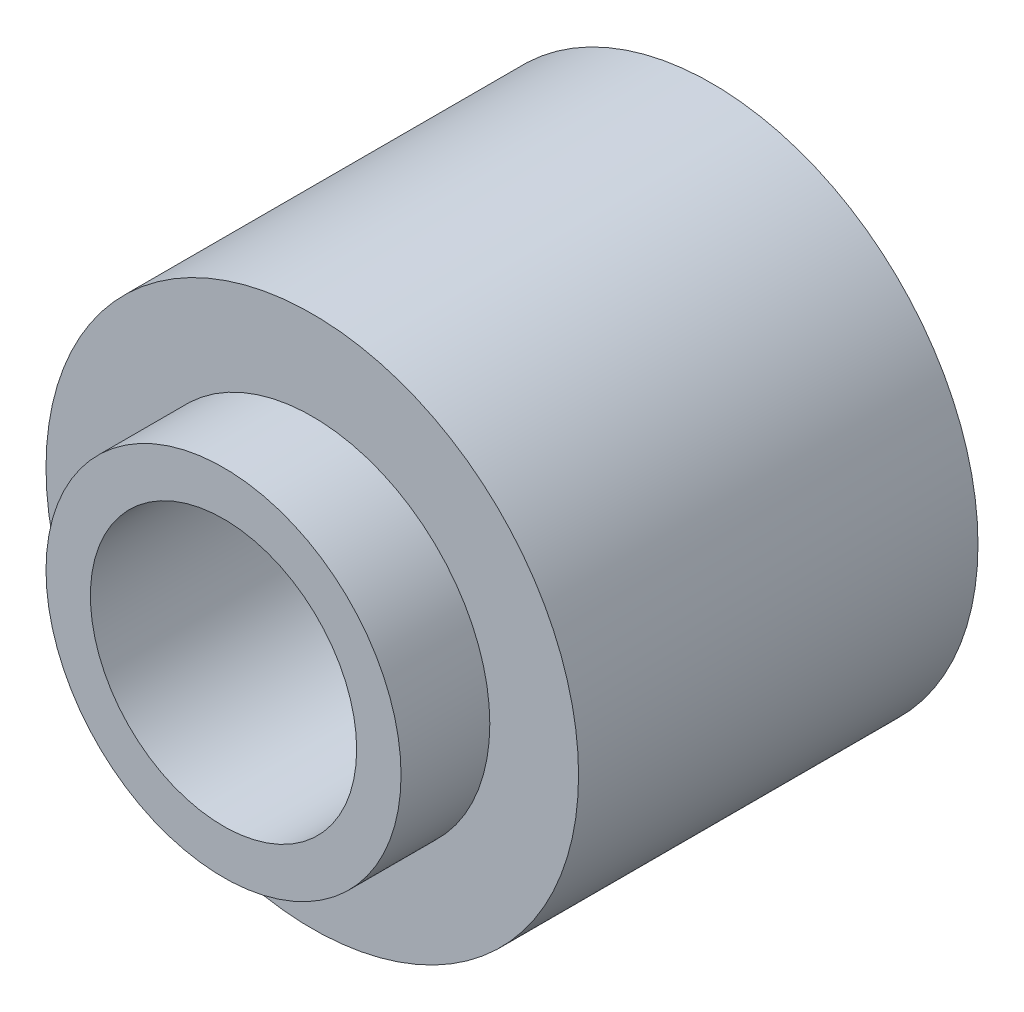
ISO-10303-21;
HEADER;
FILE_DESCRIPTION(('STEP AP214'),'2;1');
FILE_NAME('part.step','',(''),(''),'','','');
FILE_SCHEMA(('AUTOMOTIVE_DESIGN { 1 0 10303 214 1 1 1 1 }'));
ENDSEC;
DATA;
#1=APPLICATION_CONTEXT('core data for automotive mechanical design processes');
#2=APPLICATION_PROTOCOL_DEFINITION('international standard','automotive_design',2000,#1);
#3=PRODUCT_CONTEXT('',#1,'mechanical');
#4=PRODUCT('Part','Part','',(#3));
#5=PRODUCT_RELATED_PRODUCT_CATEGORY('part','',(#4));
#6=PRODUCT_DEFINITION_FORMATION('','',#4);
#7=PRODUCT_DEFINITION_CONTEXT('part definition',#1,'design');
#8=PRODUCT_DEFINITION('design','',#6,#7);
#9=PRODUCT_DEFINITION_SHAPE('','',#8);
#10=(LENGTH_UNIT() NAMED_UNIT(*) SI_UNIT(.MILLI.,.METRE.));
#11=(NAMED_UNIT(*) PLANE_ANGLE_UNIT() SI_UNIT($,.RADIAN.));
#12=(NAMED_UNIT(*) SI_UNIT($,.STERADIAN.) SOLID_ANGLE_UNIT());
#13=UNCERTAINTY_MEASURE_WITH_UNIT(LENGTH_MEASURE(1.E-05),#10,'distance_accuracy_value','');
#14=(GEOMETRIC_REPRESENTATION_CONTEXT(3) GLOBAL_UNCERTAINTY_ASSIGNED_CONTEXT((#13)) GLOBAL_UNIT_ASSIGNED_CONTEXT((#10,
#11,#12)) REPRESENTATION_CONTEXT('',''));
#15=CARTESIAN_POINT('',(0.,0.,0.));
#16=DIRECTION('',(0.,0.,1.));
#17=DIRECTION('',(1.,0.,0.));
#18=AXIS2_PLACEMENT_3D('',#15,#16,#17);
#19=CARTESIAN_POINT('',(0.,0.,9.));
#20=DIRECTION('',(0.,0.,1.));
#21=DIRECTION('',(1.,0.,0.));
#22=AXIS2_PLACEMENT_3D('',#19,#20,#21);
#23=PLANE('',#22);
#24=CARTESIAN_POINT('',(0.,0.,9.));
#25=DIRECTION('',(0.,0.,1.));
#26=DIRECTION('',(1.,0.,0.));
#27=AXIS2_PLACEMENT_3D('',#24,#25,#26);
#28=CIRCLE('',#27,6.);
#29=CARTESIAN_POINT('',(6.,0.,9.));
#30=VERTEX_POINT('',#29);
#31=EDGE_CURVE('E10',#30,#30,#28,.T.);
#32=ORIENTED_EDGE('',*,*,#31,.T.);
#33=EDGE_LOOP('',(#32));
#34=FACE_BOUND('',#33,.T.);
#35=CARTESIAN_POINT('',(0.,0.,9.));
#36=DIRECTION('',(0.,0.,1.));
#37=DIRECTION('',(1.,0.,0.));
#38=AXIS2_PLACEMENT_3D('',#35,#36,#37);
#39=CIRCLE('',#38,4.);
#40=CARTESIAN_POINT('',(4.,0.,9.));
#41=VERTEX_POINT('',#40);
#42=EDGE_CURVE('E54',#41,#41,#39,.T.);
#43=ORIENTED_EDGE('',*,*,#42,.F.);
#44=EDGE_LOOP('',(#43));
#45=FACE_BOUND('',#44,.T.);
#46=ADVANCED_FACE('F40',(#34,#45),#23,.T.);
#47=CARTESIAN_POINT('',(0.,0.,9.));
#48=DIRECTION('',(0.,0.,-1.));
#49=DIRECTION('',(-1.,0.,0.));
#50=AXIS2_PLACEMENT_3D('',#47,#48,#49);
#51=CYLINDRICAL_SURFACE('',#50,3.);
#52=CARTESIAN_POINT('',(0.,0.,0.));
#53=DIRECTION('',(0.,0.,1.));
#54=DIRECTION('',(1.,0.,0.));
#55=AXIS2_PLACEMENT_3D('',#52,#53,#54);
#56=CIRCLE('',#55,3.);
#57=CARTESIAN_POINT('',(3.,0.,0.));
#58=VERTEX_POINT('',#57);
#59=EDGE_CURVE('E52',#58,#58,#56,.T.);
#60=ORIENTED_EDGE('',*,*,#59,.F.);
#61=EDGE_LOOP('',(#60));
#62=FACE_BOUND('',#61,.T.);
#63=CARTESIAN_POINT('',(0.,0.,11.));
#64=DIRECTION('',(0.,0.,1.));
#65=DIRECTION('',(1.,0.,0.));
#66=AXIS2_PLACEMENT_3D('',#63,#64,#65);
#67=CIRCLE('',#66,3.);
#68=CARTESIAN_POINT('',(3.,0.,11.));
#69=VERTEX_POINT('',#68);
#70=EDGE_CURVE('E64',#69,#69,#67,.T.);
#71=ORIENTED_EDGE('',*,*,#70,.T.);
#72=EDGE_LOOP('',(#71));
#73=FACE_BOUND('',#72,.T.);
#74=ADVANCED_FACE('F42',(#62,#73),#51,.F.);
#75=CARTESIAN_POINT('',(0.,0.,9.));
#76=DIRECTION('',(0.,0.,-1.));
#77=DIRECTION('',(-1.,0.,0.));
#78=AXIS2_PLACEMENT_3D('',#75,#76,#77);
#79=CYLINDRICAL_SURFACE('',#78,6.);
#80=ORIENTED_EDGE('',*,*,#31,.F.);
#81=EDGE_LOOP('',(#80));
#82=FACE_BOUND('',#81,.T.);
#83=CARTESIAN_POINT('',(0.,0.,0.));
#84=DIRECTION('',(0.,0.,1.));
#85=DIRECTION('',(1.,0.,0.));
#86=AXIS2_PLACEMENT_3D('',#83,#84,#85);
#87=CIRCLE('',#86,6.);
#88=CARTESIAN_POINT('',(6.,0.,0.));
#89=VERTEX_POINT('',#88);
#90=EDGE_CURVE('E44',#89,#89,#87,.T.);
#91=ORIENTED_EDGE('',*,*,#90,.T.);
#92=EDGE_LOOP('',(#91));
#93=FACE_BOUND('',#92,.T.);
#94=ADVANCED_FACE('F81',(#82,#93),#79,.T.);
#95=CARTESIAN_POINT('',(0.,0.,0.));
#96=DIRECTION('',(0.,0.,1.));
#97=DIRECTION('',(1.,0.,0.));
#98=AXIS2_PLACEMENT_3D('',#95,#96,#97);
#99=PLANE('',#98);
#100=ORIENTED_EDGE('',*,*,#59,.T.);
#101=EDGE_LOOP('',(#100));
#102=FACE_BOUND('',#101,.T.);
#103=ORIENTED_EDGE('',*,*,#90,.F.);
#104=EDGE_LOOP('',(#103));
#105=FACE_BOUND('',#104,.T.);
#106=ADVANCED_FACE('F73',(#102,#105),#99,.F.);
#107=CARTESIAN_POINT('',(0.,0.,11.));
#108=DIRECTION('',(0.,0.,1.));
#109=DIRECTION('',(1.,0.,0.));
#110=AXIS2_PLACEMENT_3D('',#107,#108,#109);
#111=PLANE('',#110);
#112=CARTESIAN_POINT('',(0.,0.,11.));
#113=DIRECTION('',(0.,0.,1.));
#114=DIRECTION('',(1.,0.,0.));
#115=AXIS2_PLACEMENT_3D('',#112,#113,#114);
#116=CIRCLE('',#115,4.);
#117=CARTESIAN_POINT('',(4.,0.,11.));
#118=VERTEX_POINT('',#117);
#119=EDGE_CURVE('E57',#118,#118,#116,.T.);
#120=ORIENTED_EDGE('',*,*,#119,.T.);
#121=EDGE_LOOP('',(#120));
#122=FACE_BOUND('',#121,.T.);
#123=ORIENTED_EDGE('',*,*,#70,.F.);
#124=EDGE_LOOP('',(#123));
#125=FACE_BOUND('',#124,.T.);
#126=ADVANCED_FACE('F70',(#122,#125),#111,.T.);
#127=CARTESIAN_POINT('',(0.,0.,11.));
#128=DIRECTION('',(0.,0.,-1.));
#129=DIRECTION('',(-1.,0.,0.));
#130=AXIS2_PLACEMENT_3D('',#127,#128,#129);
#131=CYLINDRICAL_SURFACE('',#130,4.);
#132=ORIENTED_EDGE('',*,*,#119,.F.);
#133=EDGE_LOOP('',(#132));
#134=FACE_BOUND('',#133,.T.);
#135=ORIENTED_EDGE('',*,*,#42,.T.);
#136=EDGE_LOOP('',(#135));
#137=FACE_BOUND('',#136,.T.);
#138=ADVANCED_FACE('F72',(#134,#137),#131,.T.);
#139=CLOSED_SHELL('',(#46,#74,#94,#106,#126,#138));
#140=MANIFOLD_SOLID_BREP('B2',#139);
#141=ADVANCED_BREP_SHAPE_REPRESENTATION('',(#18,#140),#14);
#142=SHAPE_DEFINITION_REPRESENTATION(#9,#141);
ENDSEC;
END-ISO-10303-21;
